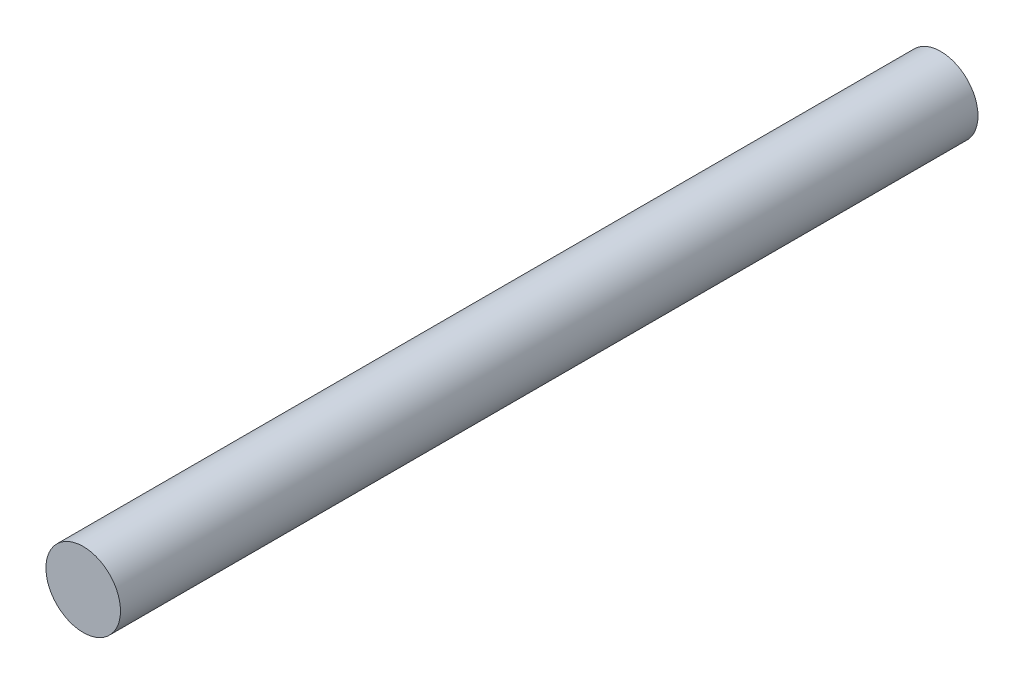
ISO-10303-21;
HEADER;
FILE_DESCRIPTION(('STEP AP214'),'2;1');
FILE_NAME('part.step','',(''),(''),'','','');
FILE_SCHEMA(('AUTOMOTIVE_DESIGN { 1 0 10303 214 1 1 1 1 }'));
ENDSEC;
DATA;
#1=APPLICATION_CONTEXT('core data for automotive mechanical design processes');
#2=APPLICATION_PROTOCOL_DEFINITION('international standard','automotive_design',2000,#1);
#3=PRODUCT_CONTEXT('',#1,'mechanical');
#4=PRODUCT('Part','Part','',(#3));
#5=PRODUCT_RELATED_PRODUCT_CATEGORY('part','',(#4));
#6=PRODUCT_DEFINITION_FORMATION('','',#4);
#7=PRODUCT_DEFINITION_CONTEXT('part definition',#1,'design');
#8=PRODUCT_DEFINITION('design','',#6,#7);
#9=PRODUCT_DEFINITION_SHAPE('','',#8);
#10=(LENGTH_UNIT() NAMED_UNIT(*) SI_UNIT(.MILLI.,.METRE.));
#11=(NAMED_UNIT(*) PLANE_ANGLE_UNIT() SI_UNIT($,.RADIAN.));
#12=(NAMED_UNIT(*) SI_UNIT($,.STERADIAN.) SOLID_ANGLE_UNIT());
#13=UNCERTAINTY_MEASURE_WITH_UNIT(LENGTH_MEASURE(1.E-05),#10,'distance_accuracy_value','');
#14=(GEOMETRIC_REPRESENTATION_CONTEXT(3) GLOBAL_UNCERTAINTY_ASSIGNED_CONTEXT((#13)) GLOBAL_UNIT_ASSIGNED_CONTEXT((#10,
#11,#12)) REPRESENTATION_CONTEXT('',''));
#15=CARTESIAN_POINT('',(0.,0.,0.));
#16=DIRECTION('',(0.,0.,1.));
#17=DIRECTION('',(1.,0.,0.));
#18=AXIS2_PLACEMENT_3D('',#15,#16,#17);
#19=CARTESIAN_POINT('',(0.,0.,23.));
#20=DIRECTION('',(0.,0.,-1.));
#21=DIRECTION('',(-1.,0.,0.));
#22=AXIS2_PLACEMENT_3D('',#19,#20,#21);
#23=CYLINDRICAL_SURFACE('',#22,1.);
#24=CARTESIAN_POINT('',(0.,0.,23.));
#25=DIRECTION('',(0.,0.,1.));
#26=DIRECTION('',(1.,0.,0.));
#27=AXIS2_PLACEMENT_3D('',#24,#25,#26);
#28=CIRCLE('',#27,1.);
#29=CARTESIAN_POINT('',(1.,0.,23.));
#30=VERTEX_POINT('',#29);
#31=EDGE_CURVE('E10',#30,#30,#28,.T.);
#32=ORIENTED_EDGE('',*,*,#31,.F.);
#33=EDGE_LOOP('',(#32));
#34=FACE_BOUND('',#33,.T.);
#35=CARTESIAN_POINT('',(0.,0.,0.));
#36=DIRECTION('',(0.,0.,1.));
#37=DIRECTION('',(1.,0.,0.));
#38=AXIS2_PLACEMENT_3D('',#35,#36,#37);
#39=CIRCLE('',#38,1.);
#40=CARTESIAN_POINT('',(1.,0.,0.));
#41=VERTEX_POINT('',#40);
#42=EDGE_CURVE('E42',#41,#41,#39,.T.);
#43=ORIENTED_EDGE('',*,*,#42,.T.);
#44=EDGE_LOOP('',(#43));
#45=FACE_BOUND('',#44,.T.);
#46=ADVANCED_FACE('F39',(#34,#45),#23,.T.);
#47=CARTESIAN_POINT('',(0.,0.,23.));
#48=DIRECTION('',(0.,0.,1.));
#49=DIRECTION('',(1.,0.,0.));
#50=AXIS2_PLACEMENT_3D('',#47,#48,#49);
#51=PLANE('',#50);
#52=ORIENTED_EDGE('',*,*,#31,.T.);
#53=EDGE_LOOP('',(#52));
#54=FACE_BOUND('',#53,.T.);
#55=ADVANCED_FACE('F54',(#54),#51,.T.);
#56=CARTESIAN_POINT('',(0.,0.,0.));
#57=DIRECTION('',(0.,0.,1.));
#58=DIRECTION('',(1.,0.,0.));
#59=AXIS2_PLACEMENT_3D('',#56,#57,#58);
#60=PLANE('',#59);
#61=ORIENTED_EDGE('',*,*,#42,.F.);
#62=EDGE_LOOP('',(#61));
#63=FACE_BOUND('',#62,.T.);
#64=ADVANCED_FACE('F52',(#63),#60,.F.);
#65=CLOSED_SHELL('',(#46,#55,#64));
#66=MANIFOLD_SOLID_BREP('B2',#65);
#67=ADVANCED_BREP_SHAPE_REPRESENTATION('',(#18,#66),#14);
#68=SHAPE_DEFINITION_REPRESENTATION(#9,#67);
ENDSEC;
END-ISO-10303-21;
